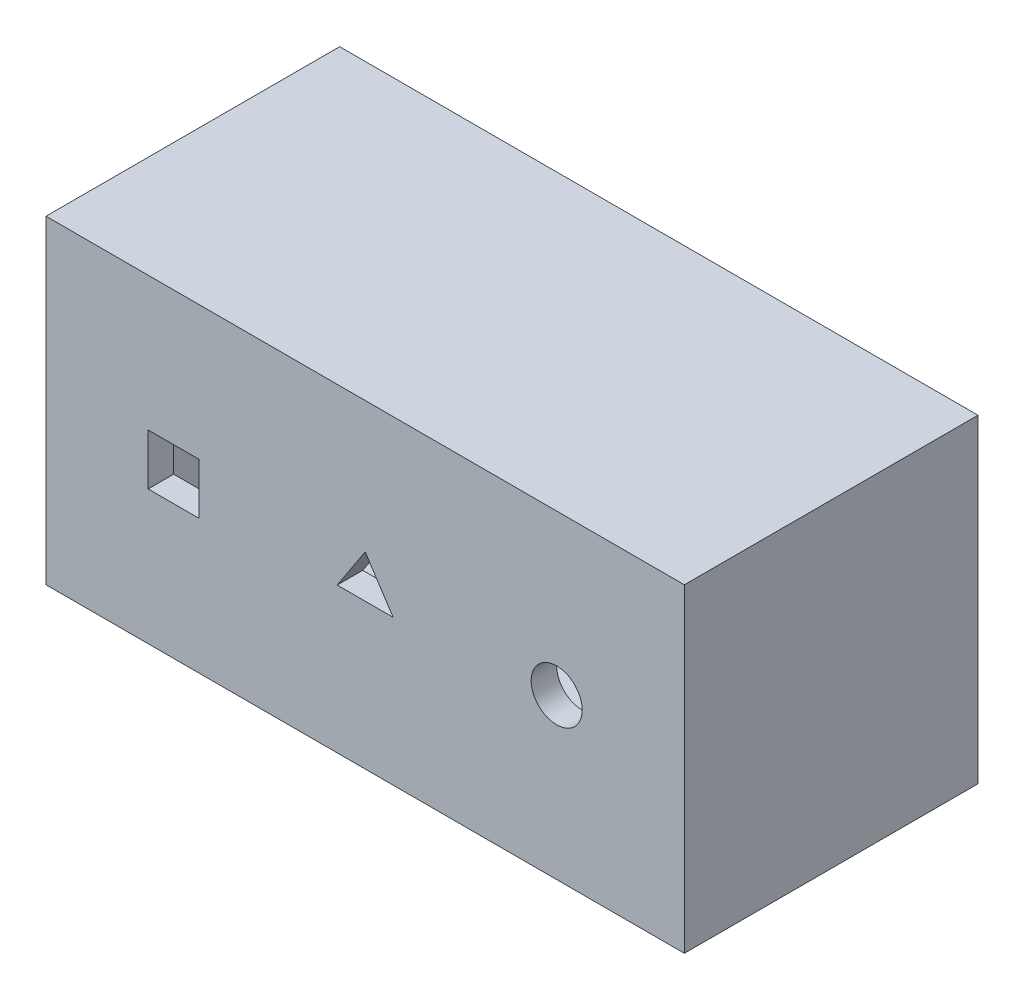
ISO-10303-21;
HEADER;
FILE_DESCRIPTION(('STEP AP214'),'2;1');
FILE_NAME('part.step','',(''),(''),'','','');
FILE_SCHEMA(('AUTOMOTIVE_DESIGN { 1 0 10303 214 1 1 1 1 }'));
ENDSEC;
DATA;
#1=APPLICATION_CONTEXT('core data for automotive mechanical design processes');
#2=APPLICATION_PROTOCOL_DEFINITION('international standard','automotive_design',2000,#1);
#3=PRODUCT_CONTEXT('',#1,'mechanical');
#4=PRODUCT('Part','Part','',(#3));
#5=PRODUCT_RELATED_PRODUCT_CATEGORY('part','',(#4));
#6=PRODUCT_DEFINITION_FORMATION('','',#4);
#7=PRODUCT_DEFINITION_CONTEXT('part definition',#1,'design');
#8=PRODUCT_DEFINITION('design','',#6,#7);
#9=PRODUCT_DEFINITION_SHAPE('','',#8);
#10=(LENGTH_UNIT() NAMED_UNIT(*) SI_UNIT(.MILLI.,.METRE.));
#11=(NAMED_UNIT(*) PLANE_ANGLE_UNIT() SI_UNIT($,.RADIAN.));
#12=(NAMED_UNIT(*) SI_UNIT($,.STERADIAN.) SOLID_ANGLE_UNIT());
#13=UNCERTAINTY_MEASURE_WITH_UNIT(LENGTH_MEASURE(1.E-05),#10,'distance_accuracy_value','');
#14=(GEOMETRIC_REPRESENTATION_CONTEXT(3) GLOBAL_UNCERTAINTY_ASSIGNED_CONTEXT((#13)) GLOBAL_UNIT_ASSIGNED_CONTEXT((#10,
#11,#12)) REPRESENTATION_CONTEXT('',''));
#15=CARTESIAN_POINT('',(0.,0.,0.));
#16=DIRECTION('',(0.,0.,1.));
#17=DIRECTION('',(1.,0.,0.));
#18=AXIS2_PLACEMENT_3D('',#15,#16,#17);
#19=CARTESIAN_POINT('',(-125.,-62.5,100.));
#20=DIRECTION('',(1.,0.,0.));
#21=DIRECTION('',(0.,0.,-1.));
#22=AXIS2_PLACEMENT_3D('',#19,#20,#21);
#23=PLANE('',#22);
#24=DIRECTION('',(0.,0.,-1.));
#25=VECTOR('',#24,1.);
#26=CARTESIAN_POINT('',(-125.,62.5,100.));
#27=LINE('',#26,#25);
#28=CARTESIAN_POINT('',(-125.,62.5,110.));
#29=VERTEX_POINT('',#28);
#30=CARTESIAN_POINT('',(-125.,62.5,-5.));
#31=VERTEX_POINT('',#30);
#32=EDGE_CURVE('E218',#29,#31,#27,.T.);
#33=ORIENTED_EDGE('',*,*,#32,.T.);
#34=DIRECTION('',(0.,1.,0.));
#35=VECTOR('',#34,1.);
#36=CARTESIAN_POINT('',(-125.,62.5,-5.));
#37=LINE('',#36,#35);
#38=CARTESIAN_POINT('',(-125.,-62.5,-5.));
#39=VERTEX_POINT('',#38);
#40=EDGE_CURVE('E176',#39,#31,#37,.T.);
#41=ORIENTED_EDGE('',*,*,#40,.F.);
#42=DIRECTION('',(0.,0.,-1.));
#43=VECTOR('',#42,1.);
#44=CARTESIAN_POINT('',(-125.,-62.5,100.));
#45=LINE('',#44,#43);
#46=CARTESIAN_POINT('',(-125.,-62.5,110.));
#47=VERTEX_POINT('',#46);
#48=EDGE_CURVE('E11',#47,#39,#45,.T.);
#49=ORIENTED_EDGE('',*,*,#48,.F.);
#50=DIRECTION('',(0.,-1.,0.));
#51=VECTOR('',#50,1.);
#52=CARTESIAN_POINT('',(-125.,0.,110.));
#53=LINE('',#52,#51);
#54=EDGE_CURVE('E240',#29,#47,#53,.T.);
#55=ORIENTED_EDGE('',*,*,#54,.F.);
#56=EDGE_LOOP('',(#33,#41,#49,#55));
#57=FACE_BOUND('',#56,.T.);
#58=ADVANCED_FACE('F35',(#57),#23,.F.);
#59=CARTESIAN_POINT('',(125.,-62.5,100.));
#60=DIRECTION('',(0.,1.,0.));
#61=DIRECTION('',(-1.,0.,0.));
#62=AXIS2_PLACEMENT_3D('',#59,#60,#61);
#63=PLANE('',#62);
#64=ORIENTED_EDGE('',*,*,#48,.T.);
#65=DIRECTION('',(-1.,0.,0.));
#66=VECTOR('',#65,1.);
#67=CARTESIAN_POINT('',(-125.,-62.5,-5.));
#68=LINE('',#67,#66);
#69=CARTESIAN_POINT('',(125.,-62.5,-5.));
#70=VERTEX_POINT('',#69);
#71=EDGE_CURVE('E186',#70,#39,#68,.T.);
#72=ORIENTED_EDGE('',*,*,#71,.F.);
#73=DIRECTION('',(0.,0.,-1.));
#74=VECTOR('',#73,1.);
#75=CARTESIAN_POINT('',(125.,-62.5,100.));
#76=LINE('',#75,#74);
#77=CARTESIAN_POINT('',(125.,-62.5,110.));
#78=VERTEX_POINT('',#77);
#79=EDGE_CURVE('E42',#78,#70,#76,.T.);
#80=ORIENTED_EDGE('',*,*,#79,.F.);
#81=DIRECTION('',(1.,0.,0.));
#82=VECTOR('',#81,1.);
#83=CARTESIAN_POINT('',(0.,-62.5,110.));
#84=LINE('',#83,#82);
#85=EDGE_CURVE('E236',#47,#78,#84,.T.);
#86=ORIENTED_EDGE('',*,*,#85,.F.);
#87=EDGE_LOOP('',(#64,#72,#80,#86));
#88=FACE_BOUND('',#87,.T.);
#89=ADVANCED_FACE('F235',(#88),#63,.F.);
#90=CARTESIAN_POINT('',(125.,-62.5,100.));
#91=DIRECTION('',(-1.,0.,0.));
#92=DIRECTION('',(0.,0.,1.));
#93=AXIS2_PLACEMENT_3D('',#90,#91,#92);
#94=PLANE('',#93);
#95=ORIENTED_EDGE('',*,*,#79,.T.);
#96=DIRECTION('',(0.,-1.,0.));
#97=VECTOR('',#96,1.);
#98=CARTESIAN_POINT('',(125.,62.5,-5.));
#99=LINE('',#98,#97);
#100=CARTESIAN_POINT('',(125.,62.5,-5.));
#101=VERTEX_POINT('',#100);
#102=EDGE_CURVE('E183',#101,#70,#99,.T.);
#103=ORIENTED_EDGE('',*,*,#102,.F.);
#104=DIRECTION('',(0.,0.,-1.));
#105=VECTOR('',#104,1.);
#106=CARTESIAN_POINT('',(125.,62.5,100.));
#107=LINE('',#106,#105);
#108=CARTESIAN_POINT('',(125.,62.5,110.));
#109=VERTEX_POINT('',#108);
#110=EDGE_CURVE('E220',#109,#101,#107,.T.);
#111=ORIENTED_EDGE('',*,*,#110,.F.);
#112=DIRECTION('',(0.,1.,0.));
#113=VECTOR('',#112,1.);
#114=CARTESIAN_POINT('',(125.,0.,110.));
#115=LINE('',#114,#113);
#116=EDGE_CURVE('E226',#78,#109,#115,.T.);
#117=ORIENTED_EDGE('',*,*,#116,.F.);
#118=EDGE_LOOP('',(#95,#103,#111,#117));
#119=FACE_BOUND('',#118,.T.);
#120=ADVANCED_FACE('F224',(#119),#94,.F.);
#121=CARTESIAN_POINT('',(125.,62.5,100.));
#122=DIRECTION('',(0.,-1.,0.));
#123=DIRECTION('',(1.,0.,0.));
#124=AXIS2_PLACEMENT_3D('',#121,#122,#123);
#125=PLANE('',#124);
#126=ORIENTED_EDGE('',*,*,#110,.T.);
#127=DIRECTION('',(1.,0.,0.));
#128=VECTOR('',#127,1.);
#129=CARTESIAN_POINT('',(-125.,62.5,-5.));
#130=LINE('',#129,#128);
#131=EDGE_CURVE('E179',#31,#101,#130,.T.);
#132=ORIENTED_EDGE('',*,*,#131,.F.);
#133=ORIENTED_EDGE('',*,*,#32,.F.);
#134=DIRECTION('',(-1.,0.,0.));
#135=VECTOR('',#134,1.);
#136=CARTESIAN_POINT('',(0.,62.5,110.));
#137=LINE('',#136,#135);
#138=EDGE_CURVE('E244',#109,#29,#137,.T.);
#139=ORIENTED_EDGE('',*,*,#138,.F.);
#140=EDGE_LOOP('',(#126,#132,#133,#139));
#141=FACE_BOUND('',#140,.T.);
#142=ADVANCED_FACE('F328',(#141),#125,.F.);
#143=CARTESIAN_POINT('',(0.,0.,-5.));
#144=DIRECTION('',(0.,0.,1.));
#145=DIRECTION('',(1.,0.,0.));
#146=AXIS2_PLACEMENT_3D('',#143,#144,#145);
#147=PLANE('',#146);
#148=ORIENTED_EDGE('',*,*,#40,.T.);
#149=ORIENTED_EDGE('',*,*,#131,.T.);
#150=ORIENTED_EDGE('',*,*,#102,.T.);
#151=ORIENTED_EDGE('',*,*,#71,.T.);
#152=EDGE_LOOP('',(#148,#149,#150,#151));
#153=FACE_BOUND('',#152,.T.);
#154=ADVANCED_FACE('F232',(#153),#147,.F.);
#155=CARTESIAN_POINT('',(5.11232212014305,3.34840909271331,110.));
#156=DIRECTION('',(0.836539380601906,0.54790680293475,0.));
#157=DIRECTION('',(-0.54790680293475,0.836539380601906,0.));
#158=AXIS2_PLACEMENT_3D('',#155,#156,#157);
#159=PLANE('',#158);
#160=DIRECTION('',(0.54790680293475,-0.836539380601906,0.));
#161=VECTOR('',#160,1.);
#162=CARTESIAN_POINT('',(5.11232212014305,3.34840909271331,100.));
#163=LINE('',#162,#161);
#164=CARTESIAN_POINT('',(0.,11.1538584080254,100.));
#165=VERTEX_POINT('',#164);
#166=CARTESIAN_POINT('',(10.958136058695,-5.5769292040127,100.));
#167=VERTEX_POINT('',#166);
#168=EDGE_CURVE('E265',#165,#167,#163,.T.);
#169=ORIENTED_EDGE('',*,*,#168,.T.);
#170=DIRECTION('',(0.,0.,-1.));
#171=VECTOR('',#170,1.);
#172=CARTESIAN_POINT('',(10.958136058695,-5.5769292040127,110.));
#173=LINE('',#172,#171);
#174=CARTESIAN_POINT('',(10.958136058695,-5.5769292040127,110.));
#175=VERTEX_POINT('',#174);
#176=EDGE_CURVE('E180',#175,#167,#173,.T.);
#177=ORIENTED_EDGE('',*,*,#176,.F.);
#178=DIRECTION('',(0.54790680293475,-0.836539380601906,0.));
#179=VECTOR('',#178,1.);
#180=CARTESIAN_POINT('',(5.11232212014305,3.34840909271331,110.));
#181=LINE('',#180,#179);
#182=CARTESIAN_POINT('',(0.,11.1538584080254,110.));
#183=VERTEX_POINT('',#182);
#184=EDGE_CURVE('E296',#183,#175,#181,.T.);
#185=ORIENTED_EDGE('',*,*,#184,.F.);
#186=DIRECTION('',(0.,0.,-1.));
#187=VECTOR('',#186,1.);
#188=CARTESIAN_POINT('',(0.,11.1538584080254,110.));
#189=LINE('',#188,#187);
#190=EDGE_CURVE('E167',#183,#165,#189,.T.);
#191=ORIENTED_EDGE('',*,*,#190,.T.);
#192=EDGE_LOOP('',(#169,#177,#185,#191));
#193=FACE_BOUND('',#192,.T.);
#194=ADVANCED_FACE('F292',(#193),#159,.F.);
#195=CARTESIAN_POINT('',(0.,-5.5769292040127,110.));
#196=DIRECTION('',(0.,-1.,0.));
#197=DIRECTION('',(1.,0.,0.));
#198=AXIS2_PLACEMENT_3D('',#195,#196,#197);
#199=PLANE('',#198);
#200=DIRECTION('',(-1.,0.,0.));
#201=VECTOR('',#200,1.);
#202=CARTESIAN_POINT('',(0.,-5.5769292040127,100.));
#203=LINE('',#202,#201);
#204=CARTESIAN_POINT('',(-10.9581360586951,-5.5769292040127,100.));
#205=VERTEX_POINT('',#204);
#206=EDGE_CURVE('E268',#167,#205,#203,.T.);
#207=ORIENTED_EDGE('',*,*,#206,.T.);
#208=DIRECTION('',(0.,0.,-1.));
#209=VECTOR('',#208,1.);
#210=CARTESIAN_POINT('',(-10.9581360586951,-5.5769292040127,110.));
#211=LINE('',#210,#209);
#212=CARTESIAN_POINT('',(-10.9581360586951,-5.5769292040127,110.));
#213=VERTEX_POINT('',#212);
#214=EDGE_CURVE('E170',#213,#205,#211,.T.);
#215=ORIENTED_EDGE('',*,*,#214,.F.);
#216=DIRECTION('',(-1.,0.,0.));
#217=VECTOR('',#216,1.);
#218=CARTESIAN_POINT('',(0.,-5.5769292040127,110.));
#219=LINE('',#218,#217);
#220=EDGE_CURVE('E303',#175,#213,#219,.T.);
#221=ORIENTED_EDGE('',*,*,#220,.F.);
#222=ORIENTED_EDGE('',*,*,#176,.T.);
#223=EDGE_LOOP('',(#207,#215,#221,#222));
#224=FACE_BOUND('',#223,.T.);
#225=ADVANCED_FACE('F302',(#224),#199,.F.);
#226=CARTESIAN_POINT('',(0.,10.,110.));
#227=DIRECTION('',(0.,1.,0.));
#228=DIRECTION('',(0.,0.,1.));
#229=AXIS2_PLACEMENT_3D('',#226,#227,#228);
#230=PLANE('',#229);
#231=DIRECTION('',(1.,0.,0.));
#232=VECTOR('',#231,1.);
#233=CARTESIAN_POINT('',(0.,10.,100.));
#234=LINE('',#233,#232);
#235=CARTESIAN_POINT('',(-85.,10.,100.));
#236=VERTEX_POINT('',#235);
#237=CARTESIAN_POINT('',(-65.,10.,100.));
#238=VERTEX_POINT('',#237);
#239=EDGE_CURVE('E166',#236,#238,#234,.T.);
#240=ORIENTED_EDGE('',*,*,#239,.T.);
#241=DIRECTION('',(0.,0.,-1.));
#242=VECTOR('',#241,1.);
#243=CARTESIAN_POINT('',(-65.,10.,110.));
#244=LINE('',#243,#242);
#245=CARTESIAN_POINT('',(-65.,10.,110.));
#246=VERTEX_POINT('',#245);
#247=EDGE_CURVE('E146',#246,#238,#244,.T.);
#248=ORIENTED_EDGE('',*,*,#247,.F.);
#249=DIRECTION('',(1.,0.,0.));
#250=VECTOR('',#249,1.);
#251=CARTESIAN_POINT('',(0.,10.,110.));
#252=LINE('',#251,#250);
#253=CARTESIAN_POINT('',(-85.,10.,110.));
#254=VERTEX_POINT('',#253);
#255=EDGE_CURVE('E153',#254,#246,#252,.T.);
#256=ORIENTED_EDGE('',*,*,#255,.F.);
#257=DIRECTION('',(0.,0.,-1.));
#258=VECTOR('',#257,1.);
#259=CARTESIAN_POINT('',(-85.,10.,110.));
#260=LINE('',#259,#258);
#261=EDGE_CURVE('E252',#254,#236,#260,.T.);
#262=ORIENTED_EDGE('',*,*,#261,.T.);
#263=EDGE_LOOP('',(#240,#248,#256,#262));
#264=FACE_BOUND('',#263,.T.);
#265=ADVANCED_FACE('F164',(#264),#230,.F.);
#266=CARTESIAN_POINT('',(-65.,0.,110.));
#267=DIRECTION('',(1.,0.,0.));
#268=DIRECTION('',(0.,0.,-1.));
#269=AXIS2_PLACEMENT_3D('',#266,#267,#268);
#270=PLANE('',#269);
#271=DIRECTION('',(0.,-1.,0.));
#272=VECTOR('',#271,1.);
#273=CARTESIAN_POINT('',(-65.,0.,100.));
#274=LINE('',#273,#272);
#275=CARTESIAN_POINT('',(-65.,-9.99999999999997,100.));
#276=VERTEX_POINT('',#275);
#277=EDGE_CURVE('E257',#238,#276,#274,.T.);
#278=ORIENTED_EDGE('',*,*,#277,.T.);
#279=DIRECTION('',(0.,0.,-1.));
#280=VECTOR('',#279,1.);
#281=CARTESIAN_POINT('',(-65.,-9.99999999999997,110.));
#282=LINE('',#281,#280);
#283=CARTESIAN_POINT('',(-65.,-9.99999999999997,110.));
#284=VERTEX_POINT('',#283);
#285=EDGE_CURVE('E148',#284,#276,#282,.T.);
#286=ORIENTED_EDGE('',*,*,#285,.F.);
#287=DIRECTION('',(0.,-1.,0.));
#288=VECTOR('',#287,1.);
#289=CARTESIAN_POINT('',(-65.,0.,110.));
#290=LINE('',#289,#288);
#291=EDGE_CURVE('E141',#246,#284,#290,.T.);
#292=ORIENTED_EDGE('',*,*,#291,.F.);
#293=ORIENTED_EDGE('',*,*,#247,.T.);
#294=EDGE_LOOP('',(#278,#286,#292,#293));
#295=FACE_BOUND('',#294,.T.);
#296=ADVANCED_FACE('F144',(#295),#270,.F.);
#297=CARTESIAN_POINT('',(0.,-9.99999999999997,110.));
#298=DIRECTION('',(0.,1.,0.));
#299=DIRECTION('',(0.,0.,1.));
#300=AXIS2_PLACEMENT_3D('',#297,#298,#299);
#301=PLANE('',#300);
#302=DIRECTION('',(1.,0.,0.));
#303=VECTOR('',#302,1.);
#304=CARTESIAN_POINT('',(0.,-9.99999999999997,100.));
#305=LINE('',#304,#303);
#306=CARTESIAN_POINT('',(-85.,-9.99999999999997,100.));
#307=VERTEX_POINT('',#306);
#308=EDGE_CURVE('E259',#307,#276,#305,.T.);
#309=ORIENTED_EDGE('',*,*,#308,.F.);
#310=DIRECTION('',(0.,0.,-1.));
#311=VECTOR('',#310,1.);
#312=CARTESIAN_POINT('',(-85.,-9.99999999999997,110.));
#313=LINE('',#312,#311);
#314=CARTESIAN_POINT('',(-85.,-9.99999999999997,110.));
#315=VERTEX_POINT('',#314);
#316=EDGE_CURVE('E172',#315,#307,#313,.T.);
#317=ORIENTED_EDGE('',*,*,#316,.F.);
#318=DIRECTION('',(1.,0.,0.));
#319=VECTOR('',#318,1.);
#320=CARTESIAN_POINT('',(0.,-9.99999999999997,110.));
#321=LINE('',#320,#319);
#322=EDGE_CURVE('E152',#315,#284,#321,.T.);
#323=ORIENTED_EDGE('',*,*,#322,.T.);
#324=ORIENTED_EDGE('',*,*,#285,.T.);
#325=EDGE_LOOP('',(#309,#317,#323,#324));
#326=FACE_BOUND('',#325,.T.);
#327=ADVANCED_FACE('F281',(#326),#301,.T.);
#328=CARTESIAN_POINT('',(-5.11232212014307,3.34840909271335,110.));
#329=DIRECTION('',(-0.836539380601904,0.547906802934753,0.));
#330=DIRECTION('',(-0.547906802934753,-0.836539380601904,0.));
#331=AXIS2_PLACEMENT_3D('',#328,#329,#330);
#332=PLANE('',#331);
#333=DIRECTION('',(0.547906802934754,0.836539380601904,0.));
#334=VECTOR('',#333,1.);
#335=CARTESIAN_POINT('',(-5.11232212014307,3.34840909271335,100.));
#336=LINE('',#335,#334);
#337=EDGE_CURVE('E270',#205,#165,#336,.T.);
#338=ORIENTED_EDGE('',*,*,#337,.T.);
#339=ORIENTED_EDGE('',*,*,#190,.F.);
#340=DIRECTION('',(0.547906802934754,0.836539380601904,0.));
#341=VECTOR('',#340,1.);
#342=CARTESIAN_POINT('',(-5.11232212014307,3.34840909271335,110.));
#343=LINE('',#342,#341);
#344=EDGE_CURVE('E247',#213,#183,#343,.T.);
#345=ORIENTED_EDGE('',*,*,#344,.F.);
#346=ORIENTED_EDGE('',*,*,#214,.T.);
#347=EDGE_LOOP('',(#338,#339,#345,#346));
#348=FACE_BOUND('',#347,.T.);
#349=ADVANCED_FACE('F299',(#348),#332,.F.);
#350=CARTESIAN_POINT('',(-85.,0.,110.));
#351=DIRECTION('',(1.,0.,0.));
#352=DIRECTION('',(0.,0.,-1.));
#353=AXIS2_PLACEMENT_3D('',#350,#351,#352);
#354=PLANE('',#353);
#355=DIRECTION('',(0.,-1.,0.));
#356=VECTOR('',#355,1.);
#357=CARTESIAN_POINT('',(-85.,0.,100.));
#358=LINE('',#357,#356);
#359=EDGE_CURVE('E262',#236,#307,#358,.T.);
#360=ORIENTED_EDGE('',*,*,#359,.F.);
#361=ORIENTED_EDGE('',*,*,#261,.F.);
#362=DIRECTION('',(0.,-1.,0.));
#363=VECTOR('',#362,1.);
#364=CARTESIAN_POINT('',(-85.,0.,110.));
#365=LINE('',#364,#363);
#366=EDGE_CURVE('E160',#254,#315,#365,.T.);
#367=ORIENTED_EDGE('',*,*,#366,.T.);
#368=ORIENTED_EDGE('',*,*,#316,.T.);
#369=EDGE_LOOP('',(#360,#361,#367,#368));
#370=FACE_BOUND('',#369,.T.);
#371=ADVANCED_FACE('F279',(#370),#354,.T.);
#372=CARTESIAN_POINT('',(74.9999999999999,0.,110.));
#373=DIRECTION('',(0.,0.,-1.));
#374=DIRECTION('',(-1.,0.,0.));
#375=AXIS2_PLACEMENT_3D('',#372,#373,#374);
#376=CYLINDRICAL_SURFACE('',#375,9.99999999999999);
#377=CARTESIAN_POINT('',(74.9999999999999,0.,110.));
#378=DIRECTION('',(0.,0.,1.));
#379=DIRECTION('',(1.,0.,0.));
#380=AXIS2_PLACEMENT_3D('',#377,#378,#379);
#381=CIRCLE('',#380,9.99999999999999);
#382=CARTESIAN_POINT('',(84.9999999999999,0.,110.));
#383=VERTEX_POINT('',#382);
#384=EDGE_CURVE('E162',#383,#383,#381,.T.);
#385=ORIENTED_EDGE('',*,*,#384,.T.);
#386=EDGE_LOOP('',(#385));
#387=FACE_BOUND('',#386,.T.);
#388=CARTESIAN_POINT('',(74.9999999999999,0.,100.));
#389=DIRECTION('',(0.,0.,1.));
#390=DIRECTION('',(1.,0.,0.));
#391=AXIS2_PLACEMENT_3D('',#388,#389,#390);
#392=CIRCLE('',#391,9.99999999999999);
#393=CARTESIAN_POINT('',(84.9999999999999,0.,100.));
#394=VERTEX_POINT('',#393);
#395=EDGE_CURVE('E253',#394,#394,#392,.T.);
#396=ORIENTED_EDGE('',*,*,#395,.F.);
#397=EDGE_LOOP('',(#396));
#398=FACE_BOUND('',#397,.T.);
#399=ADVANCED_FACE('F312',(#387,#398),#376,.F.);
#400=CARTESIAN_POINT('',(0.,0.,110.));
#401=DIRECTION('',(0.,0.,1.));
#402=DIRECTION('',(1.,0.,0.));
#403=AXIS2_PLACEMENT_3D('',#400,#401,#402);
#404=PLANE('',#403);
#405=ORIENTED_EDGE('',*,*,#384,.F.);
#406=EDGE_LOOP('',(#405));
#407=FACE_BOUND('',#406,.T.);
#408=ORIENTED_EDGE('',*,*,#255,.T.);
#409=ORIENTED_EDGE('',*,*,#291,.T.);
#410=ORIENTED_EDGE('',*,*,#322,.F.);
#411=ORIENTED_EDGE('',*,*,#366,.F.);
#412=EDGE_LOOP('',(#408,#409,#410,#411));
#413=FACE_BOUND('',#412,.T.);
#414=ORIENTED_EDGE('',*,*,#184,.T.);
#415=ORIENTED_EDGE('',*,*,#220,.T.);
#416=ORIENTED_EDGE('',*,*,#344,.T.);
#417=EDGE_LOOP('',(#414,#415,#416));
#418=FACE_BOUND('',#417,.T.);
#419=ORIENTED_EDGE('',*,*,#138,.T.);
#420=ORIENTED_EDGE('',*,*,#54,.T.);
#421=ORIENTED_EDGE('',*,*,#85,.T.);
#422=ORIENTED_EDGE('',*,*,#116,.T.);
#423=EDGE_LOOP('',(#419,#420,#421,#422));
#424=FACE_BOUND('',#423,.T.);
#425=ADVANCED_FACE('F157',(#407,#413,#418,#424),#404,.T.);
#426=CARTESIAN_POINT('',(0.,0.,100.));
#427=DIRECTION('',(0.,0.,1.));
#428=DIRECTION('',(1.,0.,0.));
#429=AXIS2_PLACEMENT_3D('',#426,#427,#428);
#430=PLANE('',#429);
#431=DIRECTION('',(1.,0.,0.));
#432=VECTOR('',#431,1.);
#433=CARTESIAN_POINT('',(115.,-57.5,100.));
#434=LINE('',#433,#432);
#435=CARTESIAN_POINT('',(-115.,-57.5,100.));
#436=VERTEX_POINT('',#435);
#437=CARTESIAN_POINT('',(115.,-57.5,100.));
#438=VERTEX_POINT('',#437);
#439=EDGE_CURVE('E193',#436,#438,#434,.T.);
#440=ORIENTED_EDGE('',*,*,#439,.F.);
#441=DIRECTION('',(0.,-1.,0.));
#442=VECTOR('',#441,1.);
#443=CARTESIAN_POINT('',(-115.,-57.5,100.));
#444=LINE('',#443,#442);
#445=CARTESIAN_POINT('',(-115.,57.5,100.));
#446=VERTEX_POINT('',#445);
#447=EDGE_CURVE('E190',#446,#436,#444,.T.);
#448=ORIENTED_EDGE('',*,*,#447,.F.);
#449=DIRECTION('',(-1.,0.,0.));
#450=VECTOR('',#449,1.);
#451=CARTESIAN_POINT('',(115.,57.5,100.));
#452=LINE('',#451,#450);
#453=CARTESIAN_POINT('',(115.,57.5,100.));
#454=VERTEX_POINT('',#453);
#455=EDGE_CURVE('E49',#454,#446,#452,.T.);
#456=ORIENTED_EDGE('',*,*,#455,.F.);
#457=DIRECTION('',(0.,1.,0.));
#458=VECTOR('',#457,1.);
#459=CARTESIAN_POINT('',(115.,-57.5,100.));
#460=LINE('',#459,#458);
#461=EDGE_CURVE('E197',#438,#454,#460,.T.);
#462=ORIENTED_EDGE('',*,*,#461,.F.);
#463=EDGE_LOOP('',(#440,#448,#456,#462));
#464=FACE_BOUND('',#463,.T.);
#465=ORIENTED_EDGE('',*,*,#395,.T.);
#466=EDGE_LOOP('',(#465));
#467=FACE_BOUND('',#466,.T.);
#468=ORIENTED_EDGE('',*,*,#239,.F.);
#469=ORIENTED_EDGE('',*,*,#359,.T.);
#470=ORIENTED_EDGE('',*,*,#308,.T.);
#471=ORIENTED_EDGE('',*,*,#277,.F.);
#472=EDGE_LOOP('',(#468,#469,#470,#471));
#473=FACE_BOUND('',#472,.T.);
#474=ORIENTED_EDGE('',*,*,#168,.F.);
#475=ORIENTED_EDGE('',*,*,#337,.F.);
#476=ORIENTED_EDGE('',*,*,#206,.F.);
#477=EDGE_LOOP('',(#474,#475,#476));
#478=FACE_BOUND('',#477,.T.);
#479=ADVANCED_FACE('F283',(#464,#467,#473,#478),#430,.F.);
#480=CARTESIAN_POINT('',(0.,0.,0.));
#481=DIRECTION('',(0.,0.,1.));
#482=DIRECTION('',(1.,0.,0.));
#483=AXIS2_PLACEMENT_3D('',#480,#481,#482);
#484=PLANE('',#483);
#485=DIRECTION('',(-1.,0.,0.));
#486=VECTOR('',#485,1.);
#487=CARTESIAN_POINT('',(115.,57.5,0.));
#488=LINE('',#487,#486);
#489=CARTESIAN_POINT('',(115.,57.5,0.));
#490=VERTEX_POINT('',#489);
#491=CARTESIAN_POINT('',(-115.,57.5,0.));
#492=VERTEX_POINT('',#491);
#493=EDGE_CURVE('E194',#490,#492,#488,.T.);
#494=ORIENTED_EDGE('',*,*,#493,.T.);
#495=DIRECTION('',(0.,-1.,0.));
#496=VECTOR('',#495,1.);
#497=CARTESIAN_POINT('',(-115.,-57.5,0.));
#498=LINE('',#497,#496);
#499=CARTESIAN_POINT('',(-115.,-57.5,0.));
#500=VERTEX_POINT('',#499);
#501=EDGE_CURVE('E189',#492,#500,#498,.T.);
#502=ORIENTED_EDGE('',*,*,#501,.T.);
#503=DIRECTION('',(1.,0.,0.));
#504=VECTOR('',#503,1.);
#505=CARTESIAN_POINT('',(115.,-57.5,0.));
#506=LINE('',#505,#504);
#507=CARTESIAN_POINT('',(115.,-57.5,0.));
#508=VERTEX_POINT('',#507);
#509=EDGE_CURVE('E203',#500,#508,#506,.T.);
#510=ORIENTED_EDGE('',*,*,#509,.T.);
#511=DIRECTION('',(0.,1.,0.));
#512=VECTOR('',#511,1.);
#513=CARTESIAN_POINT('',(115.,-57.5,0.));
#514=LINE('',#513,#512);
#515=EDGE_CURVE('E206',#508,#490,#514,.T.);
#516=ORIENTED_EDGE('',*,*,#515,.T.);
#517=EDGE_LOOP('',(#494,#502,#510,#516));
#518=FACE_BOUND('',#517,.T.);
#519=ADVANCED_FACE('F286',(#518),#484,.T.);
#520=CARTESIAN_POINT('',(115.,-57.5,100.));
#521=DIRECTION('',(-1.,0.,0.));
#522=DIRECTION('',(0.,0.,1.));
#523=AXIS2_PLACEMENT_3D('',#520,#521,#522);
#524=PLANE('',#523);
#525=ORIENTED_EDGE('',*,*,#515,.F.);
#526=DIRECTION('',(0.,0.,-1.));
#527=VECTOR('',#526,1.);
#528=CARTESIAN_POINT('',(115.,-57.5,100.));
#529=LINE('',#528,#527);
#530=EDGE_CURVE('E213',#438,#508,#529,.T.);
#531=ORIENTED_EDGE('',*,*,#530,.F.);
#532=ORIENTED_EDGE('',*,*,#461,.T.);
#533=DIRECTION('',(0.,0.,-1.));
#534=VECTOR('',#533,1.);
#535=CARTESIAN_POINT('',(115.,57.5,100.));
#536=LINE('',#535,#534);
#537=EDGE_CURVE('E56',#454,#490,#536,.T.);
#538=ORIENTED_EDGE('',*,*,#537,.T.);
#539=EDGE_LOOP('',(#525,#531,#532,#538));
#540=FACE_BOUND('',#539,.T.);
#541=ADVANCED_FACE('F343',(#540),#524,.T.);
#542=CARTESIAN_POINT('',(115.,57.5,100.));
#543=DIRECTION('',(0.,-1.,0.));
#544=DIRECTION('',(0.,0.,-1.));
#545=AXIS2_PLACEMENT_3D('',#542,#543,#544);
#546=PLANE('',#545);
#547=ORIENTED_EDGE('',*,*,#493,.F.);
#548=ORIENTED_EDGE('',*,*,#537,.F.);
#549=ORIENTED_EDGE('',*,*,#455,.T.);
#550=DIRECTION('',(0.,0.,-1.));
#551=VECTOR('',#550,1.);
#552=CARTESIAN_POINT('',(-115.,57.5,100.));
#553=LINE('',#552,#551);
#554=EDGE_CURVE('E200',#446,#492,#553,.T.);
#555=ORIENTED_EDGE('',*,*,#554,.T.);
#556=EDGE_LOOP('',(#547,#548,#549,#555));
#557=FACE_BOUND('',#556,.T.);
#558=ADVANCED_FACE('F338',(#557),#546,.T.);
#559=CARTESIAN_POINT('',(-115.,-57.5,100.));
#560=DIRECTION('',(1.,0.,0.));
#561=DIRECTION('',(0.,0.,-1.));
#562=AXIS2_PLACEMENT_3D('',#559,#560,#561);
#563=PLANE('',#562);
#564=ORIENTED_EDGE('',*,*,#501,.F.);
#565=ORIENTED_EDGE('',*,*,#554,.F.);
#566=ORIENTED_EDGE('',*,*,#447,.T.);
#567=DIRECTION('',(0.,0.,-1.));
#568=VECTOR('',#567,1.);
#569=CARTESIAN_POINT('',(-115.,-57.5,100.));
#570=LINE('',#569,#568);
#571=EDGE_CURVE('E215',#436,#500,#570,.T.);
#572=ORIENTED_EDGE('',*,*,#571,.T.);
#573=EDGE_LOOP('',(#564,#565,#566,#572));
#574=FACE_BOUND('',#573,.T.);
#575=ADVANCED_FACE('F334',(#574),#563,.T.);
#576=CARTESIAN_POINT('',(115.,-57.5,100.));
#577=DIRECTION('',(0.,1.,0.));
#578=DIRECTION('',(0.,0.,1.));
#579=AXIS2_PLACEMENT_3D('',#576,#577,#578);
#580=PLANE('',#579);
#581=ORIENTED_EDGE('',*,*,#509,.F.);
#582=ORIENTED_EDGE('',*,*,#571,.F.);
#583=ORIENTED_EDGE('',*,*,#439,.T.);
#584=ORIENTED_EDGE('',*,*,#530,.T.);
#585=EDGE_LOOP('',(#581,#582,#583,#584));
#586=FACE_BOUND('',#585,.T.);
#587=ADVANCED_FACE('F337',(#586),#580,.T.);
#588=CLOSED_SHELL('',(#58,#89,#120,#142,#154,#194,#225,#265,#296,#327,#349,#371,#399,#425,#479,
#519,#541,#558,#575,#587));
#589=MANIFOLD_SOLID_BREP('B2',#588);
#590=ADVANCED_BREP_SHAPE_REPRESENTATION('',(#18,#589),#14);
#591=SHAPE_DEFINITION_REPRESENTATION(#9,#590);
ENDSEC;
END-ISO-10303-21;
